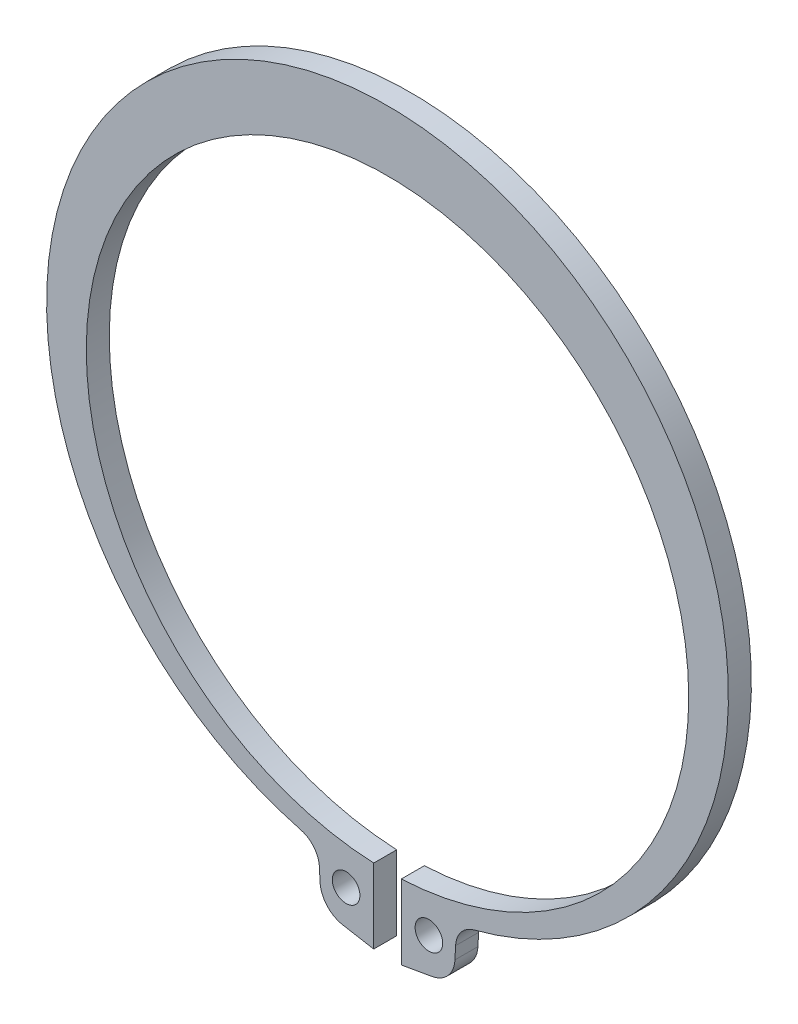
ISO-10303-21;
HEADER;
FILE_DESCRIPTION(('STEP AP214'),'2;1');
FILE_NAME('part.step','',(''),(''),'','','');
FILE_SCHEMA(('AUTOMOTIVE_DESIGN { 1 0 10303 214 1 1 1 1 }'));
ENDSEC;
DATA;
#1=APPLICATION_CONTEXT('core data for automotive mechanical design processes');
#2=APPLICATION_PROTOCOL_DEFINITION('international standard','automotive_design',2000,#1);
#3=PRODUCT_CONTEXT('',#1,'mechanical');
#4=PRODUCT('Part','Part','',(#3));
#5=PRODUCT_RELATED_PRODUCT_CATEGORY('part','',(#4));
#6=PRODUCT_DEFINITION_FORMATION('','',#4);
#7=PRODUCT_DEFINITION_CONTEXT('part definition',#1,'design');
#8=PRODUCT_DEFINITION('design','',#6,#7);
#9=PRODUCT_DEFINITION_SHAPE('','',#8);
#10=(LENGTH_UNIT() NAMED_UNIT(*) SI_UNIT(.MILLI.,.METRE.));
#11=(NAMED_UNIT(*) PLANE_ANGLE_UNIT() SI_UNIT($,.RADIAN.));
#12=(NAMED_UNIT(*) SI_UNIT($,.STERADIAN.) SOLID_ANGLE_UNIT());
#13=UNCERTAINTY_MEASURE_WITH_UNIT(LENGTH_MEASURE(1.E-05),#10,'distance_accuracy_value','');
#14=(GEOMETRIC_REPRESENTATION_CONTEXT(3) GLOBAL_UNCERTAINTY_ASSIGNED_CONTEXT((#13)) GLOBAL_UNIT_ASSIGNED_CONTEXT((#10,
#11,#12)) REPRESENTATION_CONTEXT('',''));
#15=CARTESIAN_POINT('',(0.,0.,0.));
#16=DIRECTION('',(0.,0.,1.));
#17=DIRECTION('',(1.,0.,0.));
#18=AXIS2_PLACEMENT_3D('',#15,#16,#17);
#19=CARTESIAN_POINT('',(4.3378087420289,-37.2689687377887,1.25));
#20=DIRECTION('',(0.,0.,1.));
#21=DIRECTION('',(1.,0.,0.));
#22=AXIS2_PLACEMENT_3D('',#19,#20,#21);
#23=PLANE('',#22);
#24=CARTESIAN_POINT('',(4.5,-36.5238278388232,1.25));
#25=DIRECTION('',(0.,0.,1.));
#26=DIRECTION('',(1.,0.,0.));
#27=AXIS2_PLACEMENT_3D('',#24,#25,#26);
#28=CIRCLE('',#27,1.5);
#29=CARTESIAN_POINT('',(6.,-36.5238278388232,1.25));
#30=VERTEX_POINT('',#29);
#31=EDGE_CURVE('E245',#30,#30,#28,.T.);
#32=ORIENTED_EDGE('',*,*,#31,.F.);
#33=EDGE_LOOP('',(#32));
#34=FACE_BOUND('',#33,.T.);
#35=CARTESIAN_POINT('',(4.3378087420289,-37.2689687377887,1.25));
#36=DIRECTION('',(0.,0.,1.));
#37=DIRECTION('',(1.,0.,0.));
#38=AXIS2_PLACEMENT_3D('',#35,#36,#37);
#39=CIRCLE('',#38,3.);
#40=CARTESIAN_POINT('',(4.8587532750297,-40.2233919968253,1.25));
#41=VERTEX_POINT('',#40);
#42=CARTESIAN_POINT('',(7.33426448036073,-37.4147528528981,1.25));
#43=VERTEX_POINT('',#42);
#44=EDGE_CURVE('E128',#41,#43,#39,.T.);
#45=ORIENTED_EDGE('',*,*,#44,.T.);
#46=DIRECTION('',(0.0485947050364442,0.998818579443945,0.));
#47=VECTOR('',#46,1.);
#48=CARTESIAN_POINT('',(7.33426448036073,-37.4147528528981,1.25));
#49=LINE('',#48,#47);
#50=CARTESIAN_POINT('',(7.40113922756554,-36.0402051536439,1.25));
#51=VERTEX_POINT('',#50);
#52=EDGE_CURVE('E119',#43,#51,#49,.T.);
#53=ORIENTED_EDGE('',*,*,#52,.T.);
#54=CARTESIAN_POINT('',(10.0979493920642,-36.1714108572423,1.25));
#55=DIRECTION('',(0.,0.,1.));
#56=DIRECTION('',(1.,0.,0.));
#57=AXIS2_PLACEMENT_3D('',#54,#55,#56);
#58=CIRCLE('',#57,2.7);
#59=CARTESIAN_POINT('',(9.41226656632201,-33.5599286990643,1.25));
#60=VERTEX_POINT('',#59);
#61=EDGE_CURVE('E11',#51,#60,#58,.F.);
#62=ORIENTED_EDGE('',*,*,#61,.T.);
#63=CARTESIAN_POINT('',(0.,2.2875,1.25));
#64=DIRECTION('',(0.,0.,1.));
#65=DIRECTION('',(1.,0.,0.));
#66=AXIS2_PLACEMENT_3D('',#63,#64,#65);
#67=CIRCLE('',#66,37.0625);
#68=CARTESIAN_POINT('',(-9.41226656632199,-33.5599286990643,1.25));
#69=VERTEX_POINT('',#68);
#70=EDGE_CURVE('E127',#60,#69,#67,.T.);
#71=ORIENTED_EDGE('',*,*,#70,.T.);
#72=CARTESIAN_POINT('',(-10.0979493920642,-36.1714108572423,1.25));
#73=DIRECTION('',(0.,0.,1.));
#74=DIRECTION('',(1.,0.,0.));
#75=AXIS2_PLACEMENT_3D('',#72,#73,#74);
#76=CIRCLE('',#75,2.7);
#77=CARTESIAN_POINT('',(-7.40113922756552,-36.0402051536439,1.25));
#78=VERTEX_POINT('',#77);
#79=EDGE_CURVE('E160',#69,#78,#76,.F.);
#80=ORIENTED_EDGE('',*,*,#79,.T.);
#81=DIRECTION('',(0.0485947050364442,-0.998818579443945,0.));
#82=VECTOR('',#81,1.);
#83=CARTESIAN_POINT('',(-7.33426448036071,-37.4147528528981,1.25));
#84=LINE('',#83,#82);
#85=CARTESIAN_POINT('',(-7.33426448036071,-37.4147528528981,1.25));
#86=VERTEX_POINT('',#85);
#87=EDGE_CURVE('E164',#78,#86,#84,.T.);
#88=ORIENTED_EDGE('',*,*,#87,.T.);
#89=CARTESIAN_POINT('',(-4.33780874202888,-37.2689687377887,1.25));
#90=DIRECTION('',(0.,0.,1.));
#91=DIRECTION('',(-1.,0.,0.));
#92=AXIS2_PLACEMENT_3D('',#89,#90,#91);
#93=CIRCLE('',#92,3.);
#94=CARTESIAN_POINT('',(-4.85875327502967,-40.2233919968253,1.25));
#95=VERTEX_POINT('',#94);
#96=EDGE_CURVE('E174',#86,#95,#93,.T.);
#97=ORIENTED_EDGE('',*,*,#96,.T.);
#98=DIRECTION('',(0.984807753012207,-0.173648177666934,0.));
#99=VECTOR('',#98,1.);
#100=CARTESIAN_POINT('',(-1.49999999999998,-40.815630820756,1.25));
#101=LINE('',#100,#99);
#102=CARTESIAN_POINT('',(-1.49999999999998,-40.815630820756,1.25));
#103=VERTEX_POINT('',#102);
#104=EDGE_CURVE('E223',#95,#103,#101,.T.);
#105=ORIENTED_EDGE('',*,*,#104,.T.);
#106=DIRECTION('',(0.,1.,0.));
#107=VECTOR('',#106,1.);
#108=CARTESIAN_POINT('',(-1.49999999999998,-32.715630820756,1.25));
#109=LINE('',#108,#107);
#110=CARTESIAN_POINT('',(-1.49999999999998,-32.715630820756,1.25));
#111=VERTEX_POINT('',#110);
#112=EDGE_CURVE('E239',#103,#111,#109,.T.);
#113=ORIENTED_EDGE('',*,*,#112,.T.);
#114=CARTESIAN_POINT('',(0.,0.,1.25));
#115=DIRECTION('',(0.,0.,-1.));
#116=DIRECTION('',(1.,0.,0.));
#117=AXIS2_PLACEMENT_3D('',#114,#115,#116);
#118=CIRCLE('',#117,32.75);
#119=CARTESIAN_POINT('',(1.5,-32.715630820756,1.25));
#120=VERTEX_POINT('',#119);
#121=EDGE_CURVE('E236',#111,#120,#118,.T.);
#122=ORIENTED_EDGE('',*,*,#121,.T.);
#123=DIRECTION('',(0.,-1.,0.));
#124=VECTOR('',#123,1.);
#125=CARTESIAN_POINT('',(1.5,-32.715630820756,1.25));
#126=LINE('',#125,#124);
#127=CARTESIAN_POINT('',(1.5,-40.815630820756,1.25));
#128=VERTEX_POINT('',#127);
#129=EDGE_CURVE('E238',#120,#128,#126,.T.);
#130=ORIENTED_EDGE('',*,*,#129,.T.);
#131=DIRECTION('',(0.984807753012207,0.173648177666934,0.));
#132=VECTOR('',#131,1.);
#133=CARTESIAN_POINT('',(1.5,-40.815630820756,1.25));
#134=LINE('',#133,#132);
#135=EDGE_CURVE('E133',#128,#41,#134,.T.);
#136=ORIENTED_EDGE('',*,*,#135,.T.);
#137=EDGE_LOOP('',(#45,#53,#62,#71,#80,#88,#97,#105,#113,#122,#130,#136));
#138=FACE_BOUND('',#137,.T.);
#139=CARTESIAN_POINT('',(-4.49999999999998,-36.5238278388232,1.25));
#140=DIRECTION('',(0.,0.,1.));
#141=DIRECTION('',(-1.,0.,0.));
#142=AXIS2_PLACEMENT_3D('',#139,#140,#141);
#143=CIRCLE('',#142,1.5);
#144=CARTESIAN_POINT('',(-5.99999999999998,-36.5238278388232,1.25));
#145=VERTEX_POINT('',#144);
#146=EDGE_CURVE('E252',#145,#145,#143,.T.);
#147=ORIENTED_EDGE('',*,*,#146,.F.);
#148=EDGE_LOOP('',(#147));
#149=FACE_BOUND('',#148,.T.);
#150=ADVANCED_FACE('F34',(#34,#138,#149),#23,.T.);
#151=CARTESIAN_POINT('',(4.3378087420289,-37.2689687377887,-1.25));
#152=DIRECTION('',(0.,0.,1.));
#153=DIRECTION('',(1.,0.,0.));
#154=AXIS2_PLACEMENT_3D('',#151,#152,#153);
#155=PLANE('',#154);
#156=CARTESIAN_POINT('',(4.3378087420289,-37.2689687377887,-1.25));
#157=DIRECTION('',(0.,0.,1.));
#158=DIRECTION('',(1.,0.,0.));
#159=AXIS2_PLACEMENT_3D('',#156,#157,#158);
#160=CIRCLE('',#159,3.);
#161=CARTESIAN_POINT('',(4.8587532750297,-40.2233919968253,-1.25));
#162=VERTEX_POINT('',#161);
#163=CARTESIAN_POINT('',(7.33426448036073,-37.4147528528981,-1.25));
#164=VERTEX_POINT('',#163);
#165=EDGE_CURVE('E141',#162,#164,#160,.T.);
#166=ORIENTED_EDGE('',*,*,#165,.F.);
#167=DIRECTION('',(0.984807753012207,0.173648177666934,0.));
#168=VECTOR('',#167,1.);
#169=CARTESIAN_POINT('',(1.5,-40.815630820756,-1.25));
#170=LINE('',#169,#168);
#171=CARTESIAN_POINT('',(1.5,-40.815630820756,-1.25));
#172=VERTEX_POINT('',#171);
#173=EDGE_CURVE('E137',#172,#162,#170,.T.);
#174=ORIENTED_EDGE('',*,*,#173,.F.);
#175=DIRECTION('',(0.,-1.,0.));
#176=VECTOR('',#175,1.);
#177=CARTESIAN_POINT('',(1.5,-32.715630820756,-1.25));
#178=LINE('',#177,#176);
#179=CARTESIAN_POINT('',(1.5,-32.715630820756,-1.25));
#180=VERTEX_POINT('',#179);
#181=EDGE_CURVE('E200',#180,#172,#178,.T.);
#182=ORIENTED_EDGE('',*,*,#181,.F.);
#183=CARTESIAN_POINT('',(0.,0.,-1.25));
#184=DIRECTION('',(0.,0.,-1.));
#185=DIRECTION('',(1.,0.,0.));
#186=AXIS2_PLACEMENT_3D('',#183,#184,#185);
#187=CIRCLE('',#186,32.75);
#188=CARTESIAN_POINT('',(-1.49999999999998,-32.715630820756,-1.25));
#189=VERTEX_POINT('',#188);
#190=EDGE_CURVE('E198',#189,#180,#187,.T.);
#191=ORIENTED_EDGE('',*,*,#190,.F.);
#192=DIRECTION('',(0.,1.,0.));
#193=VECTOR('',#192,1.);
#194=CARTESIAN_POINT('',(-1.49999999999998,-32.715630820756,-1.25));
#195=LINE('',#194,#193);
#196=CARTESIAN_POINT('',(-1.49999999999998,-40.815630820756,-1.25));
#197=VERTEX_POINT('',#196);
#198=EDGE_CURVE('E196',#197,#189,#195,.T.);
#199=ORIENTED_EDGE('',*,*,#198,.F.);
#200=DIRECTION('',(0.984807753012207,-0.173648177666934,0.));
#201=VECTOR('',#200,1.);
#202=CARTESIAN_POINT('',(-1.49999999999998,-40.815630820756,-1.25));
#203=LINE('',#202,#201);
#204=CARTESIAN_POINT('',(-4.85875327502967,-40.2233919968253,-1.25));
#205=VERTEX_POINT('',#204);
#206=EDGE_CURVE('E194',#205,#197,#203,.T.);
#207=ORIENTED_EDGE('',*,*,#206,.F.);
#208=CARTESIAN_POINT('',(-4.33780874202888,-37.2689687377887,-1.25));
#209=DIRECTION('',(0.,0.,1.));
#210=DIRECTION('',(-1.,0.,0.));
#211=AXIS2_PLACEMENT_3D('',#208,#209,#210);
#212=CIRCLE('',#211,3.);
#213=CARTESIAN_POINT('',(-7.33426448036071,-37.4147528528981,-1.25));
#214=VERTEX_POINT('',#213);
#215=EDGE_CURVE('E188',#214,#205,#212,.T.);
#216=ORIENTED_EDGE('',*,*,#215,.F.);
#217=DIRECTION('',(0.0485947050364442,-0.998818579443945,0.));
#218=VECTOR('',#217,1.);
#219=CARTESIAN_POINT('',(-7.33426448036071,-37.4147528528981,-1.25));
#220=LINE('',#219,#218);
#221=CARTESIAN_POINT('',(-7.40113922756552,-36.0402051536439,-1.25));
#222=VERTEX_POINT('',#221);
#223=EDGE_CURVE('E182',#222,#214,#220,.T.);
#224=ORIENTED_EDGE('',*,*,#223,.F.);
#225=CARTESIAN_POINT('',(-10.0979493920642,-36.1714108572423,-1.25));
#226=DIRECTION('',(0.,0.,1.));
#227=DIRECTION('',(1.,0.,0.));
#228=AXIS2_PLACEMENT_3D('',#225,#226,#227);
#229=CIRCLE('',#228,2.7);
#230=CARTESIAN_POINT('',(-9.41226656632199,-33.5599286990643,-1.25));
#231=VERTEX_POINT('',#230);
#232=EDGE_CURVE('E158',#222,#231,#229,.T.);
#233=ORIENTED_EDGE('',*,*,#232,.T.);
#234=CARTESIAN_POINT('',(0.,2.2875,-1.25));
#235=DIRECTION('',(0.,0.,1.));
#236=DIRECTION('',(1.,0.,0.));
#237=AXIS2_PLACEMENT_3D('',#234,#235,#236);
#238=CIRCLE('',#237,37.0625);
#239=CARTESIAN_POINT('',(9.41226656632201,-33.5599286990643,-1.25));
#240=VERTEX_POINT('',#239);
#241=EDGE_CURVE('E180',#240,#231,#238,.T.);
#242=ORIENTED_EDGE('',*,*,#241,.F.);
#243=CARTESIAN_POINT('',(10.0979493920642,-36.1714108572423,-1.25));
#244=DIRECTION('',(0.,0.,1.));
#245=DIRECTION('',(1.,0.,0.));
#246=AXIS2_PLACEMENT_3D('',#243,#244,#245);
#247=CIRCLE('',#246,2.7);
#248=CARTESIAN_POINT('',(7.40113922756554,-36.0402051536439,-1.25));
#249=VERTEX_POINT('',#248);
#250=EDGE_CURVE('E42',#240,#249,#247,.T.);
#251=ORIENTED_EDGE('',*,*,#250,.T.);
#252=DIRECTION('',(0.0485947050364442,0.998818579443945,0.));
#253=VECTOR('',#252,1.);
#254=CARTESIAN_POINT('',(7.33426448036073,-37.4147528528981,-1.25));
#255=LINE('',#254,#253);
#256=EDGE_CURVE('E186',#164,#249,#255,.T.);
#257=ORIENTED_EDGE('',*,*,#256,.F.);
#258=EDGE_LOOP('',(#166,#174,#182,#191,#199,#207,#216,#224,#233,#242,#251,#257));
#259=FACE_BOUND('',#258,.T.);
#260=CARTESIAN_POINT('',(4.5,-36.5238278388232,-1.25));
#261=DIRECTION('',(0.,0.,1.));
#262=DIRECTION('',(1.,0.,0.));
#263=AXIS2_PLACEMENT_3D('',#260,#261,#262);
#264=CIRCLE('',#263,1.5);
#265=CARTESIAN_POINT('',(6.,-36.5238278388232,-1.25));
#266=VERTEX_POINT('',#265);
#267=EDGE_CURVE('E247',#266,#266,#264,.T.);
#268=ORIENTED_EDGE('',*,*,#267,.T.);
#269=EDGE_LOOP('',(#268));
#270=FACE_BOUND('',#269,.T.);
#271=CARTESIAN_POINT('',(-4.49999999999998,-36.5238278388232,-1.25));
#272=DIRECTION('',(0.,0.,1.));
#273=DIRECTION('',(-1.,0.,0.));
#274=AXIS2_PLACEMENT_3D('',#271,#272,#273);
#275=CIRCLE('',#274,1.5);
#276=CARTESIAN_POINT('',(-5.99999999999998,-36.5238278388232,-1.25));
#277=VERTEX_POINT('',#276);
#278=EDGE_CURVE('E255',#277,#277,#275,.T.);
#279=ORIENTED_EDGE('',*,*,#278,.T.);
#280=EDGE_LOOP('',(#279));
#281=FACE_BOUND('',#280,.T.);
#282=ADVANCED_FACE('F178',(#259,#270,#281),#155,.F.);
#283=CARTESIAN_POINT('',(4.3378087420289,-37.2689687377887,1.25));
#284=DIRECTION('',(0.,0.,-1.));
#285=DIRECTION('',(-1.,0.,0.));
#286=AXIS2_PLACEMENT_3D('',#283,#284,#285);
#287=CYLINDRICAL_SURFACE('',#286,3.);
#288=ORIENTED_EDGE('',*,*,#165,.T.);
#289=DIRECTION('',(0.,0.,-1.));
#290=VECTOR('',#289,1.);
#291=CARTESIAN_POINT('',(7.33426448036073,-37.4147528528981,1.25));
#292=LINE('',#291,#290);
#293=EDGE_CURVE('E123',#43,#164,#292,.T.);
#294=ORIENTED_EDGE('',*,*,#293,.F.);
#295=ORIENTED_EDGE('',*,*,#44,.F.);
#296=DIRECTION('',(0.,0.,-1.));
#297=VECTOR('',#296,1.);
#298=CARTESIAN_POINT('',(4.8587532750297,-40.2233919968253,1.25));
#299=LINE('',#298,#297);
#300=EDGE_CURVE('E203',#41,#162,#299,.T.);
#301=ORIENTED_EDGE('',*,*,#300,.T.);
#302=EDGE_LOOP('',(#288,#294,#295,#301));
#303=FACE_BOUND('',#302,.T.);
#304=ADVANCED_FACE('F139',(#303),#287,.T.);
#305=CARTESIAN_POINT('',(7.33426448036073,-37.4147528528981,1.25));
#306=DIRECTION('',(-0.998818579443945,0.0485947050364442,0.));
#307=DIRECTION('',(-0.0485947050364442,-0.998818579443945,0.));
#308=AXIS2_PLACEMENT_3D('',#305,#306,#307);
#309=PLANE('',#308);
#310=ORIENTED_EDGE('',*,*,#256,.T.);
#311=DIRECTION('',(0.,0.,1.));
#312=VECTOR('',#311,1.);
#313=CARTESIAN_POINT('',(7.40113922756554,-36.0402051536439,1.25));
#314=LINE('',#313,#312);
#315=EDGE_CURVE('E49',#249,#51,#314,.T.);
#316=ORIENTED_EDGE('',*,*,#315,.T.);
#317=ORIENTED_EDGE('',*,*,#52,.F.);
#318=ORIENTED_EDGE('',*,*,#293,.T.);
#319=EDGE_LOOP('',(#310,#316,#317,#318));
#320=FACE_BOUND('',#319,.T.);
#321=ADVANCED_FACE('F121',(#320),#309,.F.);
#322=CARTESIAN_POINT('',(0.,2.2875,1.25));
#323=DIRECTION('',(0.,0.,-1.));
#324=DIRECTION('',(-1.,0.,0.));
#325=AXIS2_PLACEMENT_3D('',#322,#323,#324);
#326=CYLINDRICAL_SURFACE('',#325,37.0625);
#327=ORIENTED_EDGE('',*,*,#241,.T.);
#328=DIRECTION('',(0.,0.,-1.));
#329=VECTOR('',#328,1.);
#330=CARTESIAN_POINT('',(-9.41226656632199,-33.5599286990643,1.25));
#331=LINE('',#330,#329);
#332=EDGE_CURVE('E155',#231,#69,#331,.F.);
#333=ORIENTED_EDGE('',*,*,#332,.T.);
#334=ORIENTED_EDGE('',*,*,#70,.F.);
#335=DIRECTION('',(0.,0.,-1.));
#336=VECTOR('',#335,1.);
#337=CARTESIAN_POINT('',(9.41226656632201,-33.5599286990643,1.25));
#338=LINE('',#337,#336);
#339=EDGE_CURVE('E146',#60,#240,#338,.T.);
#340=ORIENTED_EDGE('',*,*,#339,.T.);
#341=EDGE_LOOP('',(#327,#333,#334,#340));
#342=FACE_BOUND('',#341,.T.);
#343=ADVANCED_FACE('F184',(#342),#326,.T.);
#344=CARTESIAN_POINT('',(-7.33426448036071,-37.4147528528981,1.25));
#345=DIRECTION('',(0.998818579443945,0.0485947050364442,0.));
#346=DIRECTION('',(-0.0485947050364442,0.998818579443945,0.));
#347=AXIS2_PLACEMENT_3D('',#344,#345,#346);
#348=PLANE('',#347);
#349=ORIENTED_EDGE('',*,*,#87,.F.);
#350=DIRECTION('',(0.,0.,1.));
#351=VECTOR('',#350,1.);
#352=CARTESIAN_POINT('',(-7.40113922756552,-36.0402051536439,-1.25));
#353=LINE('',#352,#351);
#354=EDGE_CURVE('E142',#78,#222,#353,.F.);
#355=ORIENTED_EDGE('',*,*,#354,.T.);
#356=ORIENTED_EDGE('',*,*,#223,.T.);
#357=DIRECTION('',(0.,0.,-1.));
#358=VECTOR('',#357,1.);
#359=CARTESIAN_POINT('',(-7.33426448036071,-37.4147528528981,1.25));
#360=LINE('',#359,#358);
#361=EDGE_CURVE('E143',#86,#214,#360,.T.);
#362=ORIENTED_EDGE('',*,*,#361,.F.);
#363=EDGE_LOOP('',(#349,#355,#356,#362));
#364=FACE_BOUND('',#363,.T.);
#365=ADVANCED_FACE('F171',(#364),#348,.F.);
#366=CARTESIAN_POINT('',(-4.33780874202888,-37.2689687377887,1.25));
#367=DIRECTION('',(0.,0.,-1.));
#368=DIRECTION('',(-1.,0.,0.));
#369=AXIS2_PLACEMENT_3D('',#366,#367,#368);
#370=CYLINDRICAL_SURFACE('',#369,3.);
#371=ORIENTED_EDGE('',*,*,#215,.T.);
#372=DIRECTION('',(0.,0.,-1.));
#373=VECTOR('',#372,1.);
#374=CARTESIAN_POINT('',(-4.85875327502967,-40.2233919968253,1.25));
#375=LINE('',#374,#373);
#376=EDGE_CURVE('E149',#95,#205,#375,.T.);
#377=ORIENTED_EDGE('',*,*,#376,.F.);
#378=ORIENTED_EDGE('',*,*,#96,.F.);
#379=ORIENTED_EDGE('',*,*,#361,.T.);
#380=EDGE_LOOP('',(#371,#377,#378,#379));
#381=FACE_BOUND('',#380,.T.);
#382=ADVANCED_FACE('F259',(#381),#370,.T.);
#383=CARTESIAN_POINT('',(-1.49999999999998,-40.815630820756,1.25));
#384=DIRECTION('',(0.173648177666934,0.984807753012207,0.));
#385=DIRECTION('',(-0.984807753012208,0.173648177666934,0.));
#386=AXIS2_PLACEMENT_3D('',#383,#384,#385);
#387=PLANE('',#386);
#388=ORIENTED_EDGE('',*,*,#206,.T.);
#389=DIRECTION('',(0.,0.,-1.));
#390=VECTOR('',#389,1.);
#391=CARTESIAN_POINT('',(-1.49999999999998,-40.815630820756,1.25));
#392=LINE('',#391,#390);
#393=EDGE_CURVE('E214',#103,#197,#392,.T.);
#394=ORIENTED_EDGE('',*,*,#393,.F.);
#395=ORIENTED_EDGE('',*,*,#104,.F.);
#396=ORIENTED_EDGE('',*,*,#376,.T.);
#397=EDGE_LOOP('',(#388,#394,#395,#396));
#398=FACE_BOUND('',#397,.T.);
#399=ADVANCED_FACE('F221',(#398),#387,.F.);
#400=CARTESIAN_POINT('',(-1.49999999999998,-32.715630820756,1.25));
#401=DIRECTION('',(-1.,0.,0.));
#402=DIRECTION('',(0.,-1.,0.));
#403=AXIS2_PLACEMENT_3D('',#400,#401,#402);
#404=PLANE('',#403);
#405=ORIENTED_EDGE('',*,*,#198,.T.);
#406=DIRECTION('',(0.,0.,-1.));
#407=VECTOR('',#406,1.);
#408=CARTESIAN_POINT('',(-1.49999999999998,-32.715630820756,1.25));
#409=LINE('',#408,#407);
#410=EDGE_CURVE('E211',#111,#189,#409,.T.);
#411=ORIENTED_EDGE('',*,*,#410,.F.);
#412=ORIENTED_EDGE('',*,*,#112,.F.);
#413=ORIENTED_EDGE('',*,*,#393,.T.);
#414=EDGE_LOOP('',(#405,#411,#412,#413));
#415=FACE_BOUND('',#414,.T.);
#416=ADVANCED_FACE('F230',(#415),#404,.F.);
#417=CARTESIAN_POINT('',(0.,0.,1.25));
#418=DIRECTION('',(0.,0.,-1.));
#419=DIRECTION('',(-1.,0.,0.));
#420=AXIS2_PLACEMENT_3D('',#417,#418,#419);
#421=CYLINDRICAL_SURFACE('',#420,32.75);
#422=ORIENTED_EDGE('',*,*,#190,.T.);
#423=DIRECTION('',(0.,0.,-1.));
#424=VECTOR('',#423,1.);
#425=CARTESIAN_POINT('',(1.5,-32.715630820756,1.25));
#426=LINE('',#425,#424);
#427=EDGE_CURVE('E208',#120,#180,#426,.T.);
#428=ORIENTED_EDGE('',*,*,#427,.F.);
#429=ORIENTED_EDGE('',*,*,#121,.F.);
#430=ORIENTED_EDGE('',*,*,#410,.T.);
#431=EDGE_LOOP('',(#422,#428,#429,#430));
#432=FACE_BOUND('',#431,.T.);
#433=ADVANCED_FACE('F234',(#432),#421,.F.);
#434=CARTESIAN_POINT('',(1.5,-32.715630820756,1.25));
#435=DIRECTION('',(1.,0.,0.));
#436=DIRECTION('',(0.,0.,-1.));
#437=AXIS2_PLACEMENT_3D('',#434,#435,#436);
#438=PLANE('',#437);
#439=ORIENTED_EDGE('',*,*,#181,.T.);
#440=DIRECTION('',(0.,0.,-1.));
#441=VECTOR('',#440,1.);
#442=CARTESIAN_POINT('',(1.5,-40.815630820756,1.25));
#443=LINE('',#442,#441);
#444=EDGE_CURVE('E205',#128,#172,#443,.T.);
#445=ORIENTED_EDGE('',*,*,#444,.F.);
#446=ORIENTED_EDGE('',*,*,#129,.F.);
#447=ORIENTED_EDGE('',*,*,#427,.T.);
#448=EDGE_LOOP('',(#439,#445,#446,#447));
#449=FACE_BOUND('',#448,.T.);
#450=ADVANCED_FACE('F282',(#449),#438,.F.);
#451=CARTESIAN_POINT('',(1.5,-40.815630820756,1.25));
#452=DIRECTION('',(-0.173648177666934,0.984807753012207,0.));
#453=DIRECTION('',(-0.984807753012208,-0.173648177666934,0.));
#454=AXIS2_PLACEMENT_3D('',#451,#452,#453);
#455=PLANE('',#454);
#456=ORIENTED_EDGE('',*,*,#173,.T.);
#457=ORIENTED_EDGE('',*,*,#300,.F.);
#458=ORIENTED_EDGE('',*,*,#135,.F.);
#459=ORIENTED_EDGE('',*,*,#444,.T.);
#460=EDGE_LOOP('',(#456,#457,#458,#459));
#461=FACE_BOUND('',#460,.T.);
#462=ADVANCED_FACE('F279',(#461),#455,.F.);
#463=CARTESIAN_POINT('',(4.5,-36.5238278388232,1.25));
#464=DIRECTION('',(0.,0.,-1.));
#465=DIRECTION('',(-1.,0.,0.));
#466=AXIS2_PLACEMENT_3D('',#463,#464,#465);
#467=CYLINDRICAL_SURFACE('',#466,1.5);
#468=ORIENTED_EDGE('',*,*,#31,.T.);
#469=EDGE_LOOP('',(#468));
#470=FACE_BOUND('',#469,.T.);
#471=ORIENTED_EDGE('',*,*,#267,.F.);
#472=EDGE_LOOP('',(#471));
#473=FACE_BOUND('',#472,.T.);
#474=ADVANCED_FACE('F276',(#470,#473),#467,.F.);
#475=CARTESIAN_POINT('',(-4.49999999999998,-36.5238278388232,1.25));
#476=DIRECTION('',(0.,0.,-1.));
#477=DIRECTION('',(-1.,0.,0.));
#478=AXIS2_PLACEMENT_3D('',#475,#476,#477);
#479=CYLINDRICAL_SURFACE('',#478,1.5);
#480=ORIENTED_EDGE('',*,*,#146,.T.);
#481=EDGE_LOOP('',(#480));
#482=FACE_BOUND('',#481,.T.);
#483=ORIENTED_EDGE('',*,*,#278,.F.);
#484=EDGE_LOOP('',(#483));
#485=FACE_BOUND('',#484,.T.);
#486=ADVANCED_FACE('F312',(#482,#485),#479,.F.);
#487=CARTESIAN_POINT('',(-10.0979493920642,-36.1714108572423,1.25));
#488=DIRECTION('',(0.,0.,-1.));
#489=DIRECTION('',(-1.,0.,0.));
#490=AXIS2_PLACEMENT_3D('',#487,#488,#489);
#491=CYLINDRICAL_SURFACE('',#490,2.7);
#492=ORIENTED_EDGE('',*,*,#79,.F.);
#493=ORIENTED_EDGE('',*,*,#332,.F.);
#494=ORIENTED_EDGE('',*,*,#232,.F.);
#495=ORIENTED_EDGE('',*,*,#354,.F.);
#496=EDGE_LOOP('',(#492,#493,#494,#495));
#497=FACE_BOUND('',#496,.T.);
#498=ADVANCED_FACE('F176',(#497),#491,.F.);
#499=CARTESIAN_POINT('',(10.0979493920642,-36.1714108572423,1.25));
#500=DIRECTION('',(0.,0.,-1.));
#501=DIRECTION('',(-1.,0.,0.));
#502=AXIS2_PLACEMENT_3D('',#499,#500,#501);
#503=CYLINDRICAL_SURFACE('',#502,2.7);
#504=ORIENTED_EDGE('',*,*,#61,.F.);
#505=ORIENTED_EDGE('',*,*,#315,.F.);
#506=ORIENTED_EDGE('',*,*,#250,.F.);
#507=ORIENTED_EDGE('',*,*,#339,.F.);
#508=EDGE_LOOP('',(#504,#505,#506,#507));
#509=FACE_BOUND('',#508,.T.);
#510=ADVANCED_FACE('F36',(#509),#503,.F.);
#511=CLOSED_SHELL('',(#150,#282,#304,#321,#343,#365,#382,#399,#416,#433,#450,#462,#474,#486,
#498,#510));
#512=MANIFOLD_SOLID_BREP('B2',#511);
#513=ADVANCED_BREP_SHAPE_REPRESENTATION('',(#18,#512),#14);
#514=SHAPE_DEFINITION_REPRESENTATION(#9,#513);
ENDSEC;
END-ISO-10303-21;
